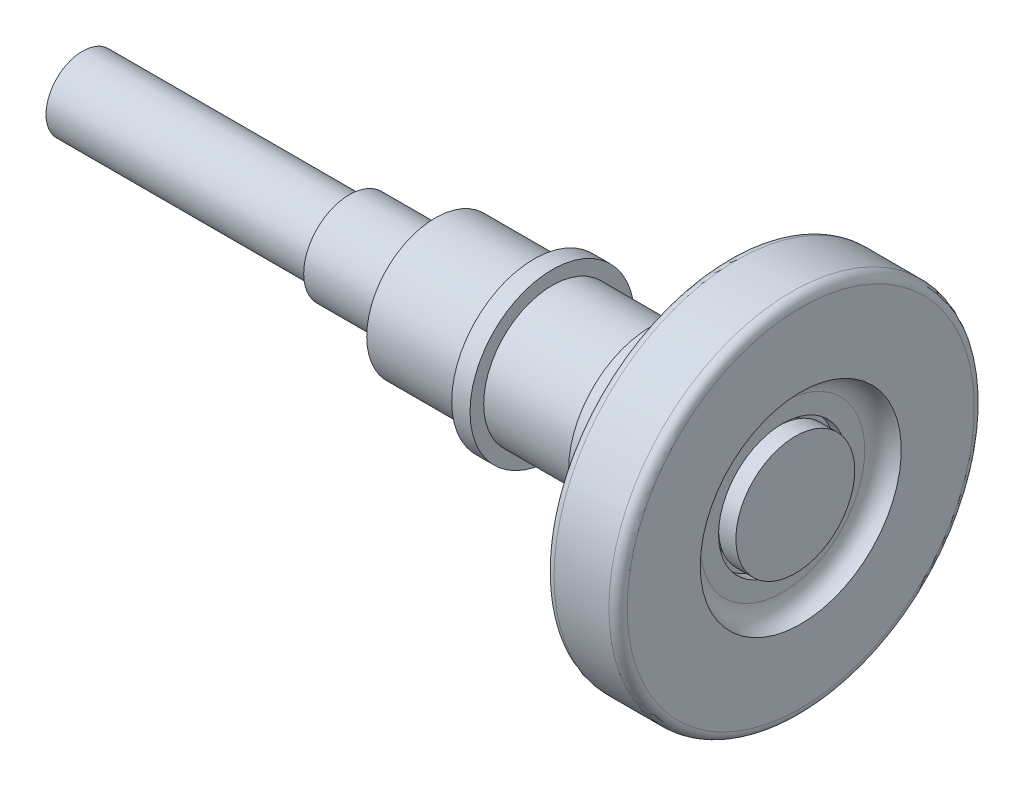
ISO-10303-21;
HEADER;
FILE_DESCRIPTION(('STEP AP214'),'2;1');
FILE_NAME('part.step','',(''),(''),'','','');
FILE_SCHEMA(('AUTOMOTIVE_DESIGN { 1 0 10303 214 1 1 1 1 }'));
ENDSEC;
DATA;
#1=APPLICATION_CONTEXT('core data for automotive mechanical design processes');
#2=APPLICATION_PROTOCOL_DEFINITION('international standard','automotive_design',2000,#1);
#3=PRODUCT_CONTEXT('',#1,'mechanical');
#4=PRODUCT('Part','Part','',(#3));
#5=PRODUCT_RELATED_PRODUCT_CATEGORY('part','',(#4));
#6=PRODUCT_DEFINITION_FORMATION('','',#4);
#7=PRODUCT_DEFINITION_CONTEXT('part definition',#1,'design');
#8=PRODUCT_DEFINITION('design','',#6,#7);
#9=PRODUCT_DEFINITION_SHAPE('','',#8);
#10=(LENGTH_UNIT() NAMED_UNIT(*) SI_UNIT(.MILLI.,.METRE.));
#11=(NAMED_UNIT(*) PLANE_ANGLE_UNIT() SI_UNIT($,.RADIAN.));
#12=(NAMED_UNIT(*) SI_UNIT($,.STERADIAN.) SOLID_ANGLE_UNIT());
#13=UNCERTAINTY_MEASURE_WITH_UNIT(LENGTH_MEASURE(1.E-05),#10,'distance_accuracy_value','');
#14=(GEOMETRIC_REPRESENTATION_CONTEXT(3) GLOBAL_UNCERTAINTY_ASSIGNED_CONTEXT((#13)) GLOBAL_UNIT_ASSIGNED_CONTEXT((#10,
#11,#12)) REPRESENTATION_CONTEXT('',''));
#15=CARTESIAN_POINT('',(0.,0.,0.));
#16=DIRECTION('',(0.,0.,1.));
#17=DIRECTION('',(1.,0.,0.));
#18=AXIS2_PLACEMENT_3D('',#15,#16,#17);
#19=CARTESIAN_POINT('',(34.,0.,0.));
#20=DIRECTION('',(-1.,0.,0.));
#21=DIRECTION('',(0.,0.,1.));
#22=AXIS2_PLACEMENT_3D('',#19,#20,#21);
#23=PLANE('',#22);
#24=CARTESIAN_POINT('',(34.,0.,0.));
#25=DIRECTION('',(-1.,0.,0.));
#26=DIRECTION('',(0.,0.,1.));
#27=AXIS2_PLACEMENT_3D('',#24,#25,#26);
#28=CIRCLE('',#27,35.);
#29=CARTESIAN_POINT('',(34.,0.,35.));
#30=VERTEX_POINT('',#29);
#31=EDGE_CURVE('E43',#30,#30,#28,.F.);
#32=ORIENTED_EDGE('',*,*,#31,.T.);
#33=EDGE_LOOP('',(#32));
#34=FACE_BOUND('',#33,.T.);
#35=CARTESIAN_POINT('',(34.,0.,0.));
#36=DIRECTION('',(-1.,0.,0.));
#37=DIRECTION('',(0.,0.,1.));
#38=AXIS2_PLACEMENT_3D('',#35,#36,#37);
#39=CIRCLE('',#38,31.);
#40=CARTESIAN_POINT('',(34.,0.,31.));
#41=VERTEX_POINT('',#40);
#42=EDGE_CURVE('E10',#41,#41,#39,.F.);
#43=ORIENTED_EDGE('',*,*,#42,.F.);
#44=EDGE_LOOP('',(#43));
#45=FACE_BOUND('',#44,.T.);
#46=ADVANCED_FACE('F32',(#34,#45),#23,.F.);
#47=CARTESIAN_POINT('',(-197.,0.,0.));
#48=DIRECTION('',(-1.,0.,0.));
#49=DIRECTION('',(0.,0.,1.));
#50=AXIS2_PLACEMENT_3D('',#47,#48,#49);
#51=PLANE('',#50);
#52=CARTESIAN_POINT('',(-197.,0.,0.));
#53=DIRECTION('',(-1.,0.,0.));
#54=DIRECTION('',(0.,0.,1.));
#55=AXIS2_PLACEMENT_3D('',#52,#53,#54);
#56=CIRCLE('',#55,25.);
#57=CARTESIAN_POINT('',(-197.,0.,25.));
#58=VERTEX_POINT('',#57);
#59=EDGE_CURVE('E98',#58,#58,#56,.T.);
#60=ORIENTED_EDGE('',*,*,#59,.T.);
#61=EDGE_LOOP('',(#60));
#62=FACE_BOUND('',#61,.T.);
#63=CARTESIAN_POINT('',(-197.,0.,0.));
#64=DIRECTION('',(-1.,0.,0.));
#65=DIRECTION('',(0.,0.,1.));
#66=AXIS2_PLACEMENT_3D('',#63,#64,#65);
#67=CIRCLE('',#66,20.);
#68=CARTESIAN_POINT('',(-197.,0.,20.));
#69=VERTEX_POINT('',#68);
#70=EDGE_CURVE('E107',#69,#69,#67,.T.);
#71=ORIENTED_EDGE('',*,*,#70,.F.);
#72=EDGE_LOOP('',(#71));
#73=FACE_BOUND('',#72,.T.);
#74=ADVANCED_FACE('F147',(#62,#73),#51,.T.);
#75=CARTESIAN_POINT('',(-150.,0.,0.));
#76=DIRECTION('',(-1.,0.,0.));
#77=DIRECTION('',(0.,0.,1.));
#78=AXIS2_PLACEMENT_3D('',#75,#76,#77);
#79=PLANE('',#78);
#80=CARTESIAN_POINT('',(-150.,0.,0.));
#81=DIRECTION('',(-1.,0.,0.));
#82=DIRECTION('',(0.,0.,1.));
#83=AXIS2_PLACEMENT_3D('',#80,#81,#82);
#84=CIRCLE('',#83,37.5);
#85=CARTESIAN_POINT('',(-150.,0.,37.5));
#86=VERTEX_POINT('',#85);
#87=EDGE_CURVE('E92',#86,#86,#84,.T.);
#88=ORIENTED_EDGE('',*,*,#87,.T.);
#89=EDGE_LOOP('',(#88));
#90=FACE_BOUND('',#89,.T.);
#91=CARTESIAN_POINT('',(-150.,0.,0.));
#92=DIRECTION('',(-1.,0.,0.));
#93=DIRECTION('',(0.,0.,1.));
#94=AXIS2_PLACEMENT_3D('',#91,#92,#93);
#95=CIRCLE('',#94,25.);
#96=CARTESIAN_POINT('',(-150.,0.,25.));
#97=VERTEX_POINT('',#96);
#98=EDGE_CURVE('E101',#97,#97,#95,.T.);
#99=ORIENTED_EDGE('',*,*,#98,.F.);
#100=EDGE_LOOP('',(#99));
#101=FACE_BOUND('',#100,.T.);
#102=ADVANCED_FACE('F153',(#90,#101),#79,.T.);
#103=CARTESIAN_POINT('',(-96.,0.,0.));
#104=DIRECTION('',(-1.,0.,0.));
#105=DIRECTION('',(0.,0.,1.));
#106=AXIS2_PLACEMENT_3D('',#103,#104,#105);
#107=PLANE('',#106);
#108=CARTESIAN_POINT('',(-96.,0.,0.));
#109=DIRECTION('',(-1.,0.,0.));
#110=DIRECTION('',(0.,0.,1.));
#111=AXIS2_PLACEMENT_3D('',#108,#109,#110);
#112=CIRCLE('',#111,45.);
#113=CARTESIAN_POINT('',(-96.,0.,45.));
#114=VERTEX_POINT('',#113);
#115=EDGE_CURVE('E86',#114,#114,#112,.T.);
#116=ORIENTED_EDGE('',*,*,#115,.T.);
#117=EDGE_LOOP('',(#116));
#118=FACE_BOUND('',#117,.T.);
#119=CARTESIAN_POINT('',(-96.,0.,0.));
#120=DIRECTION('',(-1.,0.,0.));
#121=DIRECTION('',(0.,0.,1.));
#122=AXIS2_PLACEMENT_3D('',#119,#120,#121);
#123=CIRCLE('',#122,37.5);
#124=CARTESIAN_POINT('',(-96.,0.,37.5));
#125=VERTEX_POINT('',#124);
#126=EDGE_CURVE('E95',#125,#125,#123,.T.);
#127=ORIENTED_EDGE('',*,*,#126,.F.);
#128=EDGE_LOOP('',(#127));
#129=FACE_BOUND('',#128,.T.);
#130=ADVANCED_FACE('F165',(#118,#129),#107,.T.);
#131=CARTESIAN_POINT('',(-32.,0.,0.));
#132=DIRECTION('',(-1.,0.,0.));
#133=DIRECTION('',(0.,0.,1.));
#134=AXIS2_PLACEMENT_3D('',#131,#132,#133);
#135=PLANE('',#134);
#136=CARTESIAN_POINT('',(-32.,0.,0.));
#137=DIRECTION('',(-1.,0.,0.));
#138=DIRECTION('',(0.,0.,1.));
#139=AXIS2_PLACEMENT_3D('',#136,#137,#138);
#140=CIRCLE('',#139,45.);
#141=CARTESIAN_POINT('',(-32.,0.,45.));
#142=VERTEX_POINT('',#141);
#143=EDGE_CURVE('E79',#142,#142,#140,.T.);
#144=ORIENTED_EDGE('',*,*,#143,.T.);
#145=EDGE_LOOP('',(#144));
#146=FACE_BOUND('',#145,.T.);
#147=CARTESIAN_POINT('',(-32.,0.,0.));
#148=DIRECTION('',(-1.,0.,0.));
#149=DIRECTION('',(0.,0.,1.));
#150=AXIS2_PLACEMENT_3D('',#147,#148,#149);
#151=CIRCLE('',#150,37.5);
#152=CARTESIAN_POINT('',(-32.,0.,37.5));
#153=VERTEX_POINT('',#152);
#154=EDGE_CURVE('E83',#153,#153,#151,.T.);
#155=ORIENTED_EDGE('',*,*,#154,.F.);
#156=EDGE_LOOP('',(#155));
#157=FACE_BOUND('',#156,.T.);
#158=ADVANCED_FACE('F161',(#146,#157),#135,.T.);
#159=CARTESIAN_POINT('',(0.,35.,0.));
#160=DIRECTION('',(1.,0.,0.));
#161=DIRECTION('',(0.,0.,-1.));
#162=AXIS2_PLACEMENT_3D('',#159,#160,#161);
#163=PLANE('',#162);
#164=CARTESIAN_POINT('',(0.,0.,0.));
#165=DIRECTION('',(-1.,0.,0.));
#166=DIRECTION('',(0.,0.,1.));
#167=AXIS2_PLACEMENT_3D('',#164,#165,#166);
#168=CIRCLE('',#167,70.);
#169=CARTESIAN_POINT('',(0.,0.,70.));
#170=VERTEX_POINT('',#169);
#171=EDGE_CURVE('E76',#170,#170,#168,.T.);
#172=ORIENTED_EDGE('',*,*,#171,.T.);
#173=EDGE_LOOP('',(#172));
#174=FACE_BOUND('',#173,.T.);
#175=CARTESIAN_POINT('',(0.,0.,0.));
#176=DIRECTION('',(1.,0.,0.));
#177=DIRECTION('',(0.,0.,-1.));
#178=AXIS2_PLACEMENT_3D('',#175,#176,#177);
#179=CIRCLE('',#178,45.);
#180=CARTESIAN_POINT('',(0.,0.,-45.));
#181=VERTEX_POINT('',#180);
#182=EDGE_CURVE('E39',#181,#181,#179,.F.);
#183=ORIENTED_EDGE('',*,*,#182,.F.);
#184=EDGE_LOOP('',(#183));
#185=FACE_BOUND('',#184,.T.);
#186=ADVANCED_FACE('F164',(#174,#185),#163,.F.);
#187=CARTESIAN_POINT('',(-1000.,0.,0.));
#188=DIRECTION('',(-1.,0.,0.));
#189=DIRECTION('',(0.,0.,1.));
#190=AXIS2_PLACEMENT_3D('',#187,#188,#189);
#191=CYLINDRICAL_SURFACE('',#190,35.);
#192=CARTESIAN_POINT('',(40.,0.,0.));
#193=DIRECTION('',(-1.,0.,0.));
#194=DIRECTION('',(0.,0.,1.));
#195=AXIS2_PLACEMENT_3D('',#192,#193,#194);
#196=CIRCLE('',#195,35.);
#197=CARTESIAN_POINT('',(40.,0.,35.));
#198=VERTEX_POINT('',#197);
#199=EDGE_CURVE('E73',#198,#198,#196,.T.);
#200=ORIENTED_EDGE('',*,*,#199,.F.);
#201=EDGE_LOOP('',(#200));
#202=FACE_BOUND('',#201,.T.);
#203=ORIENTED_EDGE('',*,*,#31,.F.);
#204=EDGE_LOOP('',(#203));
#205=FACE_BOUND('',#204,.T.);
#206=ADVANCED_FACE('F175',(#202,#205),#191,.F.);
#207=CARTESIAN_POINT('',(10.,70.,0.));
#208=DIRECTION('',(1.,0.,0.));
#209=DIRECTION('',(0.,0.,-1.));
#210=AXIS2_PLACEMENT_3D('',#207,#208,#209);
#211=PLANE('',#210);
#212=CARTESIAN_POINT('',(10.,0.,0.));
#213=DIRECTION('',(1.,0.,0.));
#214=DIRECTION('',(0.,0.,-1.));
#215=AXIS2_PLACEMENT_3D('',#212,#213,#214);
#216=CIRCLE('',#215,95.);
#217=CARTESIAN_POINT('',(10.,0.,-95.));
#218=VERTEX_POINT('',#217);
#219=EDGE_CURVE('E55',#218,#218,#216,.F.);
#220=ORIENTED_EDGE('',*,*,#219,.T.);
#221=EDGE_LOOP('',(#220));
#222=FACE_BOUND('',#221,.T.);
#223=CARTESIAN_POINT('',(10.,0.,0.));
#224=DIRECTION('',(1.,0.,0.));
#225=DIRECTION('',(0.,0.,-1.));
#226=AXIS2_PLACEMENT_3D('',#223,#224,#225);
#227=CIRCLE('',#226,75.);
#228=CARTESIAN_POINT('',(10.,0.,-75.));
#229=VERTEX_POINT('',#228);
#230=EDGE_CURVE('E58',#229,#229,#227,.T.);
#231=ORIENTED_EDGE('',*,*,#230,.T.);
#232=EDGE_LOOP('',(#231));
#233=FACE_BOUND('',#232,.T.);
#234=ADVANCED_FACE('F179',(#222,#233),#211,.F.);
#235=CARTESIAN_POINT('',(-1000.,0.,0.));
#236=DIRECTION('',(-1.,0.,0.));
#237=DIRECTION('',(0.,0.,1.));
#238=AXIS2_PLACEMENT_3D('',#235,#236,#237);
#239=CYLINDRICAL_SURFACE('',#238,100.);
#240=CARTESIAN_POINT('',(44.9999999999999,0.,0.));
#241=DIRECTION('',(-1.,0.,0.));
#242=DIRECTION('',(0.,0.,1.));
#243=AXIS2_PLACEMENT_3D('',#240,#241,#242);
#244=CIRCLE('',#243,100.);
#245=CARTESIAN_POINT('',(44.9999999999999,0.,100.));
#246=VERTEX_POINT('',#245);
#247=EDGE_CURVE('E64',#246,#246,#244,.T.);
#248=ORIENTED_EDGE('',*,*,#247,.T.);
#249=EDGE_LOOP('',(#248));
#250=FACE_BOUND('',#249,.T.);
#251=CARTESIAN_POINT('',(14.9999999999999,0.,0.));
#252=DIRECTION('',(1.,0.,0.));
#253=DIRECTION('',(0.,0.,-1.));
#254=AXIS2_PLACEMENT_3D('',#251,#252,#253);
#255=CIRCLE('',#254,100.);
#256=CARTESIAN_POINT('',(14.9999999999999,0.,-100.));
#257=VERTEX_POINT('',#256);
#258=EDGE_CURVE('E67',#257,#257,#255,.T.);
#259=ORIENTED_EDGE('',*,*,#258,.T.);
#260=EDGE_LOOP('',(#259));
#261=FACE_BOUND('',#260,.T.);
#262=ADVANCED_FACE('F187',(#250,#261),#239,.T.);
#263=CARTESIAN_POINT('',(50.,100.,0.));
#264=DIRECTION('',(-1.,0.,0.));
#265=DIRECTION('',(0.,0.,1.));
#266=AXIS2_PLACEMENT_3D('',#263,#264,#265);
#267=PLANE('',#266);
#268=CARTESIAN_POINT('',(50.,0.,0.));
#269=DIRECTION('',(-1.,0.,0.));
#270=DIRECTION('',(0.,0.,1.));
#271=AXIS2_PLACEMENT_3D('',#268,#269,#270);
#272=CIRCLE('',#271,95.);
#273=CARTESIAN_POINT('',(50.,0.,95.));
#274=VERTEX_POINT('',#273);
#275=EDGE_CURVE('E61',#274,#274,#272,.F.);
#276=ORIENTED_EDGE('',*,*,#275,.T.);
#277=EDGE_LOOP('',(#276));
#278=FACE_BOUND('',#277,.T.);
#279=CARTESIAN_POINT('',(50.,0.,0.));
#280=DIRECTION('',(-1.,0.,0.));
#281=DIRECTION('',(0.,0.,1.));
#282=AXIS2_PLACEMENT_3D('',#279,#280,#281);
#283=CIRCLE('',#282,55.);
#284=CARTESIAN_POINT('',(50.,0.,55.));
#285=VERTEX_POINT('',#284);
#286=EDGE_CURVE('E70',#285,#285,#283,.T.);
#287=ORIENTED_EDGE('',*,*,#286,.T.);
#288=EDGE_LOOP('',(#287));
#289=FACE_BOUND('',#288,.T.);
#290=ADVANCED_FACE('F183',(#278,#289),#267,.F.);
#291=CARTESIAN_POINT('',(40.,55.,0.));
#292=DIRECTION('',(-1.,0.,0.));
#293=DIRECTION('',(0.,0.,1.));
#294=AXIS2_PLACEMENT_3D('',#291,#292,#293);
#295=PLANE('',#294);
#296=CARTESIAN_POINT('',(40.,0.,0.));
#297=DIRECTION('',(-1.,0.,0.));
#298=DIRECTION('',(0.,0.,1.));
#299=AXIS2_PLACEMENT_3D('',#296,#297,#298);
#300=CIRCLE('',#299,45.);
#301=CARTESIAN_POINT('',(40.,0.,45.));
#302=VERTEX_POINT('',#301);
#303=EDGE_CURVE('E47',#302,#302,#300,.F.);
#304=ORIENTED_EDGE('',*,*,#303,.T.);
#305=EDGE_LOOP('',(#304));
#306=FACE_BOUND('',#305,.T.);
#307=ORIENTED_EDGE('',*,*,#199,.T.);
#308=EDGE_LOOP('',(#307));
#309=FACE_BOUND('',#308,.T.);
#310=ADVANCED_FACE('F171',(#306,#309),#295,.F.);
#311=CARTESIAN_POINT('',(-1000.,0.,0.));
#312=DIRECTION('',(-1.,0.,0.));
#313=DIRECTION('',(0.,0.,1.));
#314=AXIS2_PLACEMENT_3D('',#311,#312,#313);
#315=CYLINDRICAL_SURFACE('',#314,70.);
#316=CARTESIAN_POINT('',(4.99999999999989,0.,0.));
#317=DIRECTION('',(1.,0.,0.));
#318=DIRECTION('',(0.,0.,-1.));
#319=AXIS2_PLACEMENT_3D('',#316,#317,#318);
#320=CIRCLE('',#319,70.);
#321=CARTESIAN_POINT('',(4.99999999999989,0.,-70.));
#322=VERTEX_POINT('',#321);
#323=EDGE_CURVE('E52',#322,#322,#320,.F.);
#324=ORIENTED_EDGE('',*,*,#323,.T.);
#325=EDGE_LOOP('',(#324));
#326=FACE_BOUND('',#325,.T.);
#327=ORIENTED_EDGE('',*,*,#171,.F.);
#328=EDGE_LOOP('',(#327));
#329=FACE_BOUND('',#328,.T.);
#330=ADVANCED_FACE('F167',(#326,#329),#315,.T.);
#331=CARTESIAN_POINT('',(44.9999999999999,0.,0.));
#332=DIRECTION('',(-1.,0.,0.));
#333=DIRECTION('',(0.,0.,1.));
#334=AXIS2_PLACEMENT_3D('',#331,#332,#333);
#335=TOROIDAL_SURFACE('',#334,95.,5.);
#336=ORIENTED_EDGE('',*,*,#275,.F.);
#337=EDGE_LOOP('',(#336));
#338=FACE_BOUND('',#337,.T.);
#339=ORIENTED_EDGE('',*,*,#247,.F.);
#340=EDGE_LOOP('',(#339));
#341=FACE_BOUND('',#340,.T.);
#342=ADVANCED_FACE('F170',(#338,#341),#335,.T.);
#343=CARTESIAN_POINT('',(14.9999999999999,0.,0.));
#344=DIRECTION('',(1.,0.,0.));
#345=DIRECTION('',(0.,0.,-1.));
#346=AXIS2_PLACEMENT_3D('',#343,#344,#345);
#347=TOROIDAL_SURFACE('',#346,95.,5.);
#348=ORIENTED_EDGE('',*,*,#258,.F.);
#349=EDGE_LOOP('',(#348));
#350=FACE_BOUND('',#349,.T.);
#351=ORIENTED_EDGE('',*,*,#219,.F.);
#352=EDGE_LOOP('',(#351));
#353=FACE_BOUND('',#352,.T.);
#354=ADVANCED_FACE('F197',(#350,#353),#347,.T.);
#355=CARTESIAN_POINT('',(4.99999999999989,0.,0.));
#356=DIRECTION('',(1.,0.,0.));
#357=DIRECTION('',(0.,0.,-1.));
#358=AXIS2_PLACEMENT_3D('',#355,#356,#357);
#359=TOROIDAL_SURFACE('',#358,75.,5.);
#360=ORIENTED_EDGE('',*,*,#230,.F.);
#361=EDGE_LOOP('',(#360));
#362=FACE_BOUND('',#361,.T.);
#363=ORIENTED_EDGE('',*,*,#323,.F.);
#364=EDGE_LOOP('',(#363));
#365=FACE_BOUND('',#364,.T.);
#366=ADVANCED_FACE('F200',(#362,#365),#359,.F.);
#367=CARTESIAN_POINT('',(50.,0.,0.));
#368=DIRECTION('',(-1.,0.,0.));
#369=DIRECTION('',(0.,0.,1.));
#370=AXIS2_PLACEMENT_3D('',#367,#368,#369);
#371=TOROIDAL_SURFACE('',#370,45.,10.);
#372=ORIENTED_EDGE('',*,*,#303,.F.);
#373=EDGE_LOOP('',(#372));
#374=FACE_BOUND('',#373,.T.);
#375=ORIENTED_EDGE('',*,*,#286,.F.);
#376=EDGE_LOOP('',(#375));
#377=FACE_BOUND('',#376,.T.);
#378=ADVANCED_FACE('F34',(#374,#377),#371,.F.);
#379=CARTESIAN_POINT('',(-32.,0.,0.));
#380=DIRECTION('',(1.,0.,0.));
#381=DIRECTION('',(0.,0.,-1.));
#382=AXIS2_PLACEMENT_3D('',#379,#380,#381);
#383=CYLINDRICAL_SURFACE('',#382,45.);
#384=ORIENTED_EDGE('',*,*,#143,.F.);
#385=EDGE_LOOP('',(#384));
#386=FACE_BOUND('',#385,.T.);
#387=ORIENTED_EDGE('',*,*,#182,.T.);
#388=EDGE_LOOP('',(#387));
#389=FACE_BOUND('',#388,.T.);
#390=ADVANCED_FACE('F159',(#386,#389),#383,.T.);
#391=CARTESIAN_POINT('',(-86.,0.,0.));
#392=DIRECTION('',(1.,0.,0.));
#393=DIRECTION('',(0.,0.,-1.));
#394=AXIS2_PLACEMENT_3D('',#391,#392,#393);
#395=CYLINDRICAL_SURFACE('',#394,37.5);
#396=CARTESIAN_POINT('',(-86.,0.,0.));
#397=DIRECTION('',(-1.,0.,0.));
#398=DIRECTION('',(0.,0.,1.));
#399=AXIS2_PLACEMENT_3D('',#396,#397,#398);
#400=CIRCLE('',#399,37.5);
#401=CARTESIAN_POINT('',(-86.,0.,37.5));
#402=VERTEX_POINT('',#401);
#403=EDGE_CURVE('E82',#402,#402,#400,.T.);
#404=ORIENTED_EDGE('',*,*,#403,.F.);
#405=EDGE_LOOP('',(#404));
#406=FACE_BOUND('',#405,.T.);
#407=ORIENTED_EDGE('',*,*,#154,.T.);
#408=EDGE_LOOP('',(#407));
#409=FACE_BOUND('',#408,.T.);
#410=ADVANCED_FACE('F218',(#406,#409),#395,.T.);
#411=CARTESIAN_POINT('',(-86.,0.,0.));
#412=DIRECTION('',(-1.,0.,0.));
#413=DIRECTION('',(0.,0.,1.));
#414=AXIS2_PLACEMENT_3D('',#411,#412,#413);
#415=PLANE('',#414);
#416=CARTESIAN_POINT('',(-86.,0.,0.));
#417=DIRECTION('',(-1.,0.,0.));
#418=DIRECTION('',(0.,0.,1.));
#419=AXIS2_PLACEMENT_3D('',#416,#417,#418);
#420=CIRCLE('',#419,45.);
#421=CARTESIAN_POINT('',(-86.,0.,45.));
#422=VERTEX_POINT('',#421);
#423=EDGE_CURVE('E89',#422,#422,#420,.T.);
#424=ORIENTED_EDGE('',*,*,#423,.F.);
#425=EDGE_LOOP('',(#424));
#426=FACE_BOUND('',#425,.T.);
#427=ORIENTED_EDGE('',*,*,#403,.T.);
#428=EDGE_LOOP('',(#427));
#429=FACE_BOUND('',#428,.T.);
#430=ADVANCED_FACE('F231',(#426,#429),#415,.F.);
#431=CARTESIAN_POINT('',(-96.,0.,0.));
#432=DIRECTION('',(1.,0.,0.));
#433=DIRECTION('',(0.,0.,-1.));
#434=AXIS2_PLACEMENT_3D('',#431,#432,#433);
#435=CYLINDRICAL_SURFACE('',#434,45.);
#436=ORIENTED_EDGE('',*,*,#115,.F.);
#437=EDGE_LOOP('',(#436));
#438=FACE_BOUND('',#437,.T.);
#439=ORIENTED_EDGE('',*,*,#423,.T.);
#440=EDGE_LOOP('',(#439));
#441=FACE_BOUND('',#440,.T.);
#442=ADVANCED_FACE('F240',(#438,#441),#435,.T.);
#443=CARTESIAN_POINT('',(-150.,0.,0.));
#444=DIRECTION('',(1.,0.,0.));
#445=DIRECTION('',(0.,0.,-1.));
#446=AXIS2_PLACEMENT_3D('',#443,#444,#445);
#447=CYLINDRICAL_SURFACE('',#446,37.5);
#448=ORIENTED_EDGE('',*,*,#87,.F.);
#449=EDGE_LOOP('',(#448));
#450=FACE_BOUND('',#449,.T.);
#451=ORIENTED_EDGE('',*,*,#126,.T.);
#452=EDGE_LOOP('',(#451));
#453=FACE_BOUND('',#452,.T.);
#454=ADVANCED_FACE('F246',(#450,#453),#447,.T.);
#455=CARTESIAN_POINT('',(-197.,0.,0.));
#456=DIRECTION('',(1.,0.,0.));
#457=DIRECTION('',(0.,0.,-1.));
#458=AXIS2_PLACEMENT_3D('',#455,#456,#457);
#459=CYLINDRICAL_SURFACE('',#458,25.);
#460=ORIENTED_EDGE('',*,*,#59,.F.);
#461=EDGE_LOOP('',(#460));
#462=FACE_BOUND('',#461,.T.);
#463=ORIENTED_EDGE('',*,*,#98,.T.);
#464=EDGE_LOOP('',(#463));
#465=FACE_BOUND('',#464,.T.);
#466=ADVANCED_FACE('F254',(#462,#465),#459,.T.);
#467=CARTESIAN_POINT('',(-343.,0.,0.));
#468=DIRECTION('',(1.,0.,0.));
#469=DIRECTION('',(0.,0.,-1.));
#470=AXIS2_PLACEMENT_3D('',#467,#468,#469);
#471=CYLINDRICAL_SURFACE('',#470,20.);
#472=CARTESIAN_POINT('',(-343.,0.,0.));
#473=DIRECTION('',(-1.,0.,0.));
#474=DIRECTION('',(0.,0.,1.));
#475=AXIS2_PLACEMENT_3D('',#472,#473,#474);
#476=CIRCLE('',#475,20.);
#477=CARTESIAN_POINT('',(-343.,0.,20.));
#478=VERTEX_POINT('',#477);
#479=EDGE_CURVE('E104',#478,#478,#476,.T.);
#480=ORIENTED_EDGE('',*,*,#479,.F.);
#481=EDGE_LOOP('',(#480));
#482=FACE_BOUND('',#481,.T.);
#483=ORIENTED_EDGE('',*,*,#70,.T.);
#484=EDGE_LOOP('',(#483));
#485=FACE_BOUND('',#484,.T.);
#486=ADVANCED_FACE('F143',(#482,#485),#471,.T.);
#487=CARTESIAN_POINT('',(-343.,0.,0.));
#488=DIRECTION('',(-1.,0.,0.));
#489=DIRECTION('',(0.,0.,1.));
#490=AXIS2_PLACEMENT_3D('',#487,#488,#489);
#491=PLANE('',#490);
#492=ORIENTED_EDGE('',*,*,#479,.T.);
#493=EDGE_LOOP('',(#492));
#494=FACE_BOUND('',#493,.T.);
#495=ADVANCED_FACE('F138',(#494),#491,.T.);
#496=CARTESIAN_POINT('',(37.5,0.,0.));
#497=DIRECTION('',(-1.,0.,0.));
#498=DIRECTION('',(0.,0.,1.));
#499=AXIS2_PLACEMENT_3D('',#496,#497,#498);
#500=CYLINDRICAL_SURFACE('',#499,31.);
#501=CARTESIAN_POINT('',(37.5,0.,0.));
#502=DIRECTION('',(1.,0.,0.));
#503=DIRECTION('',(0.,0.,-1.));
#504=AXIS2_PLACEMENT_3D('',#501,#502,#503);
#505=CIRCLE('',#504,31.);
#506=CARTESIAN_POINT('',(37.5,0.,-31.));
#507=VERTEX_POINT('',#506);
#508=EDGE_CURVE('E110',#507,#507,#505,.T.);
#509=ORIENTED_EDGE('',*,*,#508,.F.);
#510=EDGE_LOOP('',(#509));
#511=FACE_BOUND('',#510,.T.);
#512=ORIENTED_EDGE('',*,*,#42,.T.);
#513=EDGE_LOOP('',(#512));
#514=FACE_BOUND('',#513,.T.);
#515=ADVANCED_FACE('F133',(#511,#514),#500,.T.);
#516=CARTESIAN_POINT('',(37.5,0.,0.));
#517=DIRECTION('',(1.,0.,0.));
#518=DIRECTION('',(0.,0.,-1.));
#519=AXIS2_PLACEMENT_3D('',#516,#517,#518);
#520=PLANE('',#519);
#521=CARTESIAN_POINT('',(37.5,0.,0.));
#522=DIRECTION('',(1.,0.,0.));
#523=DIRECTION('',(0.,0.,-1.));
#524=AXIS2_PLACEMENT_3D('',#521,#522,#523);
#525=CIRCLE('',#524,32.5);
#526=CARTESIAN_POINT('',(37.5,0.,-32.5));
#527=VERTEX_POINT('',#526);
#528=EDGE_CURVE('E116',#527,#527,#525,.T.);
#529=ORIENTED_EDGE('',*,*,#528,.F.);
#530=EDGE_LOOP('',(#529));
#531=FACE_BOUND('',#530,.T.);
#532=ORIENTED_EDGE('',*,*,#508,.T.);
#533=EDGE_LOOP('',(#532));
#534=FACE_BOUND('',#533,.T.);
#535=ADVANCED_FACE('F127',(#531,#534),#520,.F.);
#536=CARTESIAN_POINT('',(47.,0.,0.));
#537=DIRECTION('',(-1.,0.,0.));
#538=DIRECTION('',(0.,0.,1.));
#539=AXIS2_PLACEMENT_3D('',#536,#537,#538);
#540=CYLINDRICAL_SURFACE('',#539,32.5);
#541=CARTESIAN_POINT('',(47.,0.,0.));
#542=DIRECTION('',(1.,0.,0.));
#543=DIRECTION('',(0.,0.,-1.));
#544=AXIS2_PLACEMENT_3D('',#541,#542,#543);
#545=CIRCLE('',#544,32.5);
#546=CARTESIAN_POINT('',(47.,0.,-32.5));
#547=VERTEX_POINT('',#546);
#548=EDGE_CURVE('E115',#547,#547,#545,.T.);
#549=ORIENTED_EDGE('',*,*,#548,.F.);
#550=EDGE_LOOP('',(#549));
#551=FACE_BOUND('',#550,.T.);
#552=ORIENTED_EDGE('',*,*,#528,.T.);
#553=EDGE_LOOP('',(#552));
#554=FACE_BOUND('',#553,.T.);
#555=ADVANCED_FACE('F124',(#551,#554),#540,.T.);
#556=CARTESIAN_POINT('',(47.,0.,0.));
#557=DIRECTION('',(1.,0.,0.));
#558=DIRECTION('',(0.,0.,-1.));
#559=AXIS2_PLACEMENT_3D('',#556,#557,#558);
#560=PLANE('',#559);
#561=ORIENTED_EDGE('',*,*,#548,.T.);
#562=EDGE_LOOP('',(#561));
#563=FACE_BOUND('',#562,.T.);
#564=ADVANCED_FACE('F122',(#563),#560,.T.);
#565=CLOSED_SHELL('',(#46,#74,#102,#130,#158,#186,#206,#234,#262,#290,#310,#330,#342,#354,#366,
#378,#390,#410,#430,#442,#454,#466,#486,#495,#515,#535,#555,#564));
#566=MANIFOLD_SOLID_BREP('B2',#565);
#567=ADVANCED_BREP_SHAPE_REPRESENTATION('',(#18,#566),#14);
#568=SHAPE_DEFINITION_REPRESENTATION(#9,#567);
ENDSEC;
END-ISO-10303-21;
